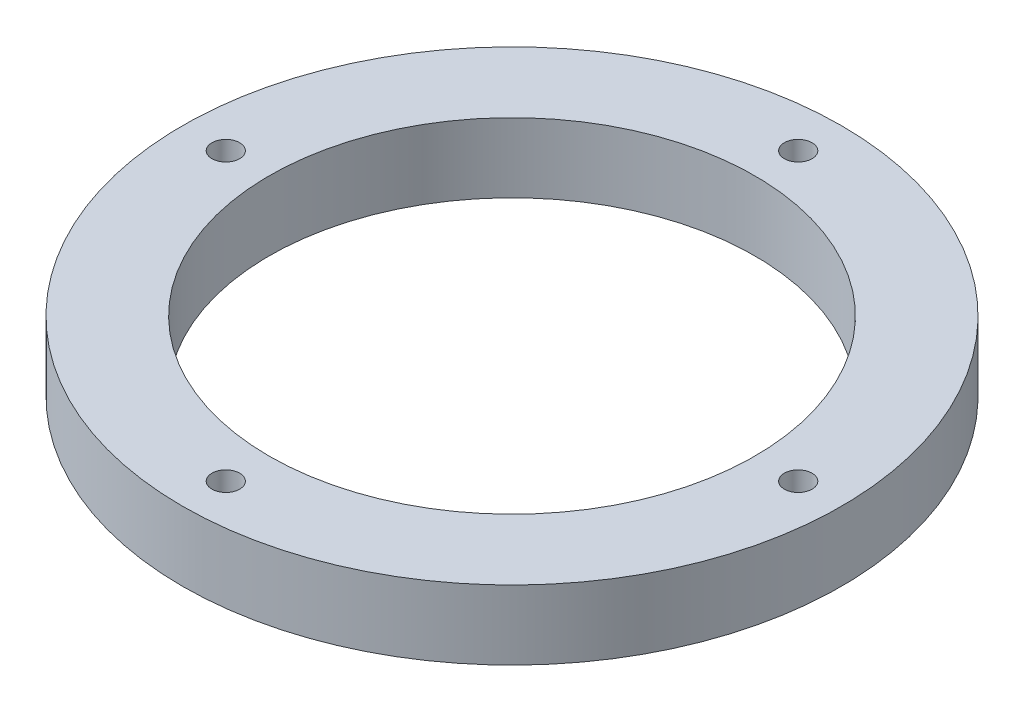
ISO-10303-21;
HEADER;
FILE_DESCRIPTION(('STEP AP214'),'2;1');
FILE_NAME('part.step','',(''),(''),'','','');
FILE_SCHEMA(('AUTOMOTIVE_DESIGN { 1 0 10303 214 1 1 1 1 }'));
ENDSEC;
DATA;
#1=APPLICATION_CONTEXT('core data for automotive mechanical design processes');
#2=APPLICATION_PROTOCOL_DEFINITION('international standard','automotive_design',2000,#1);
#3=PRODUCT_CONTEXT('',#1,'mechanical');
#4=PRODUCT('Part','Part','',(#3));
#5=PRODUCT_RELATED_PRODUCT_CATEGORY('part','',(#4));
#6=PRODUCT_DEFINITION_FORMATION('','',#4);
#7=PRODUCT_DEFINITION_CONTEXT('part definition',#1,'design');
#8=PRODUCT_DEFINITION('design','',#6,#7);
#9=PRODUCT_DEFINITION_SHAPE('','',#8);
#10=(LENGTH_UNIT() NAMED_UNIT(*) SI_UNIT(.MILLI.,.METRE.));
#11=(NAMED_UNIT(*) PLANE_ANGLE_UNIT() SI_UNIT($,.RADIAN.));
#12=(NAMED_UNIT(*) SI_UNIT($,.STERADIAN.) SOLID_ANGLE_UNIT());
#13=UNCERTAINTY_MEASURE_WITH_UNIT(LENGTH_MEASURE(1.E-05),#10,'distance_accuracy_value','');
#14=(GEOMETRIC_REPRESENTATION_CONTEXT(3) GLOBAL_UNCERTAINTY_ASSIGNED_CONTEXT((#13)) GLOBAL_UNIT_ASSIGNED_CONTEXT((#10,
#11,#12)) REPRESENTATION_CONTEXT('',''));
#15=CARTESIAN_POINT('',(0.,0.,0.));
#16=DIRECTION('',(0.,0.,1.));
#17=DIRECTION('',(1.,0.,0.));
#18=AXIS2_PLACEMENT_3D('',#15,#16,#17);
#19=CARTESIAN_POINT('',(0.,10.,0.));
#20=DIRECTION('',(0.,-1.,0.));
#21=DIRECTION('',(0.,0.,-1.));
#22=AXIS2_PLACEMENT_3D('',#19,#20,#21);
#23=CYLINDRICAL_SURFACE('',#22,47.5);
#24=CARTESIAN_POINT('',(0.,10.,0.));
#25=DIRECTION('',(0.,1.,0.));
#26=DIRECTION('',(0.,0.,1.));
#27=AXIS2_PLACEMENT_3D('',#24,#25,#26);
#28=CIRCLE('',#27,47.5);
#29=CARTESIAN_POINT('',(0.,10.,47.5));
#30=VERTEX_POINT('',#29);
#31=EDGE_CURVE('E10',#30,#30,#28,.T.);
#32=ORIENTED_EDGE('',*,*,#31,.F.);
#33=EDGE_LOOP('',(#32));
#34=FACE_BOUND('',#33,.T.);
#35=CARTESIAN_POINT('',(0.,0.,0.));
#36=DIRECTION('',(0.,1.,0.));
#37=DIRECTION('',(0.,0.,1.));
#38=AXIS2_PLACEMENT_3D('',#35,#36,#37);
#39=CIRCLE('',#38,47.5);
#40=CARTESIAN_POINT('',(0.,0.,47.5));
#41=VERTEX_POINT('',#40);
#42=EDGE_CURVE('E39',#41,#41,#39,.T.);
#43=ORIENTED_EDGE('',*,*,#42,.T.);
#44=EDGE_LOOP('',(#43));
#45=FACE_BOUND('',#44,.T.);
#46=ADVANCED_FACE('F36',(#34,#45),#23,.T.);
#47=CARTESIAN_POINT('',(0.,10.,0.));
#48=DIRECTION('',(0.,1.,0.));
#49=DIRECTION('',(0.,0.,1.));
#50=AXIS2_PLACEMENT_3D('',#47,#48,#49);
#51=PLANE('',#50);
#52=CARTESIAN_POINT('',(-41.25,10.,1.44023605227279E-13));
#53=DIRECTION('',(0.,1.,0.));
#54=DIRECTION('',(1.,0.,0.));
#55=AXIS2_PLACEMENT_3D('',#52,#53,#54);
#56=CIRCLE('',#55,2.);
#57=CARTESIAN_POINT('',(-39.25,10.,1.37040642549593E-13));
#58=VERTEX_POINT('',#57);
#59=EDGE_CURVE('E79',#58,#58,#56,.T.);
#60=ORIENTED_EDGE('',*,*,#59,.F.);
#61=EDGE_LOOP('',(#60));
#62=FACE_BOUND('',#61,.T.);
#63=CARTESIAN_POINT('',(0.,10.,41.25));
#64=DIRECTION('',(0.,1.,0.));
#65=DIRECTION('',(0.,0.,-1.));
#66=AXIS2_PLACEMENT_3D('',#63,#64,#65);
#67=CIRCLE('',#66,2.);
#68=CARTESIAN_POINT('',(0.,10.,39.25));
#69=VERTEX_POINT('',#68);
#70=EDGE_CURVE('E70',#69,#69,#67,.T.);
#71=ORIENTED_EDGE('',*,*,#70,.F.);
#72=EDGE_LOOP('',(#71));
#73=FACE_BOUND('',#72,.T.);
#74=CARTESIAN_POINT('',(41.25,10.,-4.32070815681838E-13));
#75=DIRECTION('',(0.,1.,0.));
#76=DIRECTION('',(-1.,0.,0.));
#77=AXIS2_PLACEMENT_3D('',#74,#75,#76);
#78=CIRCLE('',#77,2.);
#79=CARTESIAN_POINT('',(39.25,10.,-4.11121927648779E-13));
#80=VERTEX_POINT('',#79);
#81=EDGE_CURVE('E71',#80,#80,#78,.T.);
#82=ORIENTED_EDGE('',*,*,#81,.F.);
#83=EDGE_LOOP('',(#82));
#84=FACE_BOUND('',#83,.T.);
#85=CARTESIAN_POINT('',(0.,10.,-41.25));
#86=DIRECTION('',(0.,1.,0.));
#87=DIRECTION('',(0.,0.,1.));
#88=AXIS2_PLACEMENT_3D('',#85,#86,#87);
#89=CIRCLE('',#88,2.);
#90=CARTESIAN_POINT('',(0.,10.,-39.25));
#91=VERTEX_POINT('',#90);
#92=EDGE_CURVE('E61',#91,#91,#89,.T.);
#93=ORIENTED_EDGE('',*,*,#92,.F.);
#94=EDGE_LOOP('',(#93));
#95=FACE_BOUND('',#94,.T.);
#96=CARTESIAN_POINT('',(0.,10.,0.));
#97=DIRECTION('',(0.,1.,0.));
#98=DIRECTION('',(0.,0.,1.));
#99=AXIS2_PLACEMENT_3D('',#96,#97,#98);
#100=CIRCLE('',#99,35.);
#101=CARTESIAN_POINT('',(0.,10.,35.));
#102=VERTEX_POINT('',#101);
#103=EDGE_CURVE('E53',#102,#102,#100,.T.);
#104=ORIENTED_EDGE('',*,*,#103,.F.);
#105=EDGE_LOOP('',(#104));
#106=FACE_BOUND('',#105,.T.);
#107=ORIENTED_EDGE('',*,*,#31,.T.);
#108=EDGE_LOOP('',(#107));
#109=FACE_BOUND('',#108,.T.);
#110=ADVANCED_FACE('F92',(#62,#73,#84,#95,#106,#109),#51,.T.);
#111=CARTESIAN_POINT('',(0.,0.,0.));
#112=DIRECTION('',(0.,1.,0.));
#113=DIRECTION('',(0.,0.,1.));
#114=AXIS2_PLACEMENT_3D('',#111,#112,#113);
#115=PLANE('',#114);
#116=CARTESIAN_POINT('',(-41.25,0.,1.44023605227279E-13));
#117=DIRECTION('',(0.,1.,0.));
#118=DIRECTION('',(0.,0.,1.));
#119=AXIS2_PLACEMENT_3D('',#116,#117,#118);
#120=CIRCLE('',#119,2.);
#121=CARTESIAN_POINT('',(-41.25,0.,2.00000000000014));
#122=VERTEX_POINT('',#121);
#123=EDGE_CURVE('E65',#122,#122,#120,.F.);
#124=ORIENTED_EDGE('',*,*,#123,.F.);
#125=EDGE_LOOP('',(#124));
#126=FACE_BOUND('',#125,.T.);
#127=CARTESIAN_POINT('',(0.,0.,41.25));
#128=DIRECTION('',(0.,1.,0.));
#129=DIRECTION('',(0.,0.,1.));
#130=AXIS2_PLACEMENT_3D('',#127,#128,#129);
#131=CIRCLE('',#130,2.);
#132=CARTESIAN_POINT('',(0.,0.,43.25));
#133=VERTEX_POINT('',#132);
#134=EDGE_CURVE('E75',#133,#133,#131,.F.);
#135=ORIENTED_EDGE('',*,*,#134,.F.);
#136=EDGE_LOOP('',(#135));
#137=FACE_BOUND('',#136,.T.);
#138=CARTESIAN_POINT('',(41.25,0.,-4.32070815681838E-13));
#139=DIRECTION('',(0.,1.,0.));
#140=DIRECTION('',(0.,0.,1.));
#141=AXIS2_PLACEMENT_3D('',#138,#139,#140);
#142=CIRCLE('',#141,2.);
#143=CARTESIAN_POINT('',(41.25,0.,1.99999999999957));
#144=VERTEX_POINT('',#143);
#145=EDGE_CURVE('E66',#144,#144,#142,.F.);
#146=ORIENTED_EDGE('',*,*,#145,.F.);
#147=EDGE_LOOP('',(#146));
#148=FACE_BOUND('',#147,.T.);
#149=CARTESIAN_POINT('',(0.,0.,-41.25));
#150=DIRECTION('',(0.,1.,0.));
#151=DIRECTION('',(0.,0.,1.));
#152=AXIS2_PLACEMENT_3D('',#149,#150,#151);
#153=CIRCLE('',#152,2.);
#154=CARTESIAN_POINT('',(0.,0.,-39.25));
#155=VERTEX_POINT('',#154);
#156=EDGE_CURVE('E57',#155,#155,#153,.F.);
#157=ORIENTED_EDGE('',*,*,#156,.F.);
#158=EDGE_LOOP('',(#157));
#159=FACE_BOUND('',#158,.T.);
#160=CARTESIAN_POINT('',(0.,0.,0.));
#161=DIRECTION('',(0.,1.,0.));
#162=DIRECTION('',(0.,0.,1.));
#163=AXIS2_PLACEMENT_3D('',#160,#161,#162);
#164=CIRCLE('',#163,35.);
#165=CARTESIAN_POINT('',(0.,0.,35.));
#166=VERTEX_POINT('',#165);
#167=EDGE_CURVE('E48',#166,#166,#164,.F.);
#168=ORIENTED_EDGE('',*,*,#167,.F.);
#169=EDGE_LOOP('',(#168));
#170=FACE_BOUND('',#169,.T.);
#171=ORIENTED_EDGE('',*,*,#42,.F.);
#172=EDGE_LOOP('',(#171));
#173=FACE_BOUND('',#172,.T.);
#174=ADVANCED_FACE('F95',(#126,#137,#148,#159,#170,#173),#115,.F.);
#175=CARTESIAN_POINT('',(0.,-98.9949493661167,0.));
#176=DIRECTION('',(0.,1.,0.));
#177=DIRECTION('',(0.,0.,1.));
#178=AXIS2_PLACEMENT_3D('',#175,#176,#177);
#179=CYLINDRICAL_SURFACE('',#178,35.);
#180=ORIENTED_EDGE('',*,*,#167,.T.);
#181=EDGE_LOOP('',(#180));
#182=FACE_BOUND('',#181,.T.);
#183=ORIENTED_EDGE('',*,*,#103,.T.);
#184=EDGE_LOOP('',(#183));
#185=FACE_BOUND('',#184,.T.);
#186=ADVANCED_FACE('F105',(#182,#185),#179,.F.);
#187=CARTESIAN_POINT('',(0.,-5.65685424949238,-41.25));
#188=DIRECTION('',(0.,1.,0.));
#189=DIRECTION('',(0.,0.,1.));
#190=AXIS2_PLACEMENT_3D('',#187,#188,#189);
#191=CYLINDRICAL_SURFACE('',#190,2.);
#192=ORIENTED_EDGE('',*,*,#156,.T.);
#193=EDGE_LOOP('',(#192));
#194=FACE_BOUND('',#193,.T.);
#195=ORIENTED_EDGE('',*,*,#92,.T.);
#196=EDGE_LOOP('',(#195));
#197=FACE_BOUND('',#196,.T.);
#198=ADVANCED_FACE('F107',(#194,#197),#191,.F.);
#199=CARTESIAN_POINT('',(41.25,-5.65685424949238,-4.32070815681838E-13));
#200=DIRECTION('',(0.,1.,0.));
#201=DIRECTION('',(0.,0.,1.));
#202=AXIS2_PLACEMENT_3D('',#199,#200,#201);
#203=CYLINDRICAL_SURFACE('',#202,2.);
#204=ORIENTED_EDGE('',*,*,#145,.T.);
#205=EDGE_LOOP('',(#204));
#206=FACE_BOUND('',#205,.T.);
#207=ORIENTED_EDGE('',*,*,#81,.T.);
#208=EDGE_LOOP('',(#207));
#209=FACE_BOUND('',#208,.T.);
#210=ADVANCED_FACE('F114',(#206,#209),#203,.F.);
#211=CARTESIAN_POINT('',(0.,-5.65685424949238,41.25));
#212=DIRECTION('',(0.,1.,0.));
#213=DIRECTION('',(0.,0.,1.));
#214=AXIS2_PLACEMENT_3D('',#211,#212,#213);
#215=CYLINDRICAL_SURFACE('',#214,2.);
#216=ORIENTED_EDGE('',*,*,#134,.T.);
#217=EDGE_LOOP('',(#216));
#218=FACE_BOUND('',#217,.T.);
#219=ORIENTED_EDGE('',*,*,#70,.T.);
#220=EDGE_LOOP('',(#219));
#221=FACE_BOUND('',#220,.T.);
#222=ADVANCED_FACE('F144',(#218,#221),#215,.F.);
#223=CARTESIAN_POINT('',(-41.25,-5.65685424949238,1.44023605227279E-13));
#224=DIRECTION('',(0.,1.,0.));
#225=DIRECTION('',(0.,0.,1.));
#226=AXIS2_PLACEMENT_3D('',#223,#224,#225);
#227=CYLINDRICAL_SURFACE('',#226,2.);
#228=ORIENTED_EDGE('',*,*,#123,.T.);
#229=EDGE_LOOP('',(#228));
#230=FACE_BOUND('',#229,.T.);
#231=ORIENTED_EDGE('',*,*,#59,.T.);
#232=EDGE_LOOP('',(#231));
#233=FACE_BOUND('',#232,.T.);
#234=ADVANCED_FACE('F90',(#230,#233),#227,.F.);
#235=CLOSED_SHELL('',(#46,#110,#174,#186,#198,#210,#222,#234));
#236=MANIFOLD_SOLID_BREP('B2',#235);
#237=ADVANCED_BREP_SHAPE_REPRESENTATION('',(#18,#236),#14);
#238=SHAPE_DEFINITION_REPRESENTATION(#9,#237);
ENDSEC;
END-ISO-10303-21;
